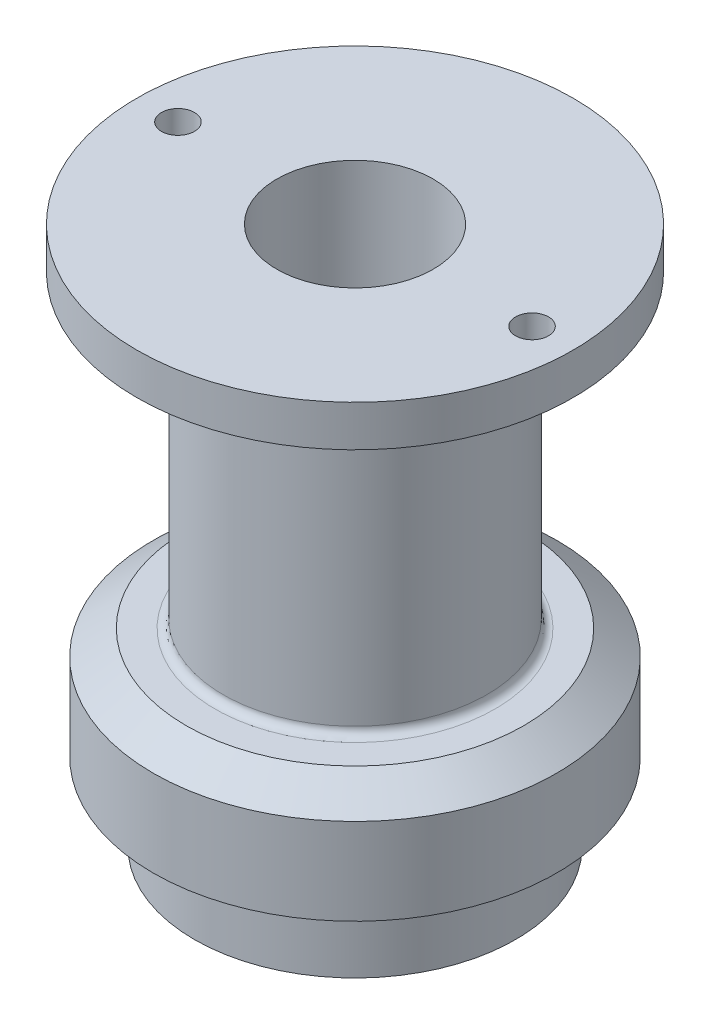
ISO-10303-21;
HEADER;
FILE_DESCRIPTION(('STEP AP214'),'2;1');
FILE_NAME('part.step','',(''),(''),'','','');
FILE_SCHEMA(('AUTOMOTIVE_DESIGN { 1 0 10303 214 1 1 1 1 }'));
ENDSEC;
DATA;
#1=APPLICATION_CONTEXT('core data for automotive mechanical design processes');
#2=APPLICATION_PROTOCOL_DEFINITION('international standard','automotive_design',2000,#1);
#3=PRODUCT_CONTEXT('',#1,'mechanical');
#4=PRODUCT('Part','Part','',(#3));
#5=PRODUCT_RELATED_PRODUCT_CATEGORY('part','',(#4));
#6=PRODUCT_DEFINITION_FORMATION('','',#4);
#7=PRODUCT_DEFINITION_CONTEXT('part definition',#1,'design');
#8=PRODUCT_DEFINITION('design','',#6,#7);
#9=PRODUCT_DEFINITION_SHAPE('','',#8);
#10=(LENGTH_UNIT() NAMED_UNIT(*) SI_UNIT(.MILLI.,.METRE.));
#11=(NAMED_UNIT(*) PLANE_ANGLE_UNIT() SI_UNIT($,.RADIAN.));
#12=(NAMED_UNIT(*) SI_UNIT($,.STERADIAN.) SOLID_ANGLE_UNIT());
#13=UNCERTAINTY_MEASURE_WITH_UNIT(LENGTH_MEASURE(1.E-05),#10,'distance_accuracy_value','');
#14=(GEOMETRIC_REPRESENTATION_CONTEXT(3) GLOBAL_UNCERTAINTY_ASSIGNED_CONTEXT((#13)) GLOBAL_UNIT_ASSIGNED_CONTEXT((#10,
#11,#12)) REPRESENTATION_CONTEXT('',''));
#15=CARTESIAN_POINT('',(0.,0.,0.));
#16=DIRECTION('',(0.,0.,1.));
#17=DIRECTION('',(1.,0.,0.));
#18=AXIS2_PLACEMENT_3D('',#15,#16,#17);
#19=CARTESIAN_POINT('',(0.,0.,0.));
#20=DIRECTION('',(0.,-1.,0.));
#21=DIRECTION('',(0.,0.,-1.));
#22=AXIS2_PLACEMENT_3D('',#19,#20,#21);
#23=CYLINDRICAL_SURFACE('',#22,13.5);
#24=CARTESIAN_POINT('',(0.,0.,0.));
#25=DIRECTION('',(0.,-1.,0.));
#26=DIRECTION('',(0.,0.,-1.));
#27=AXIS2_PLACEMENT_3D('',#24,#25,#26);
#28=CIRCLE('',#27,13.5);
#29=CARTESIAN_POINT('',(0.,0.,-13.5));
#30=VERTEX_POINT('',#29);
#31=EDGE_CURVE('E47',#30,#30,#28,.T.);
#32=ORIENTED_EDGE('',*,*,#31,.T.);
#33=EDGE_LOOP('',(#32));
#34=FACE_BOUND('',#33,.T.);
#35=CARTESIAN_POINT('',(0.,8.,0.));
#36=DIRECTION('',(0.,-1.,0.));
#37=DIRECTION('',(0.,0.,-1.));
#38=AXIS2_PLACEMENT_3D('',#35,#36,#37);
#39=CIRCLE('',#38,13.5);
#40=CARTESIAN_POINT('',(0.,8.,-13.5));
#41=VERTEX_POINT('',#40);
#42=EDGE_CURVE('E10',#41,#41,#39,.T.);
#43=ORIENTED_EDGE('',*,*,#42,.F.);
#44=EDGE_LOOP('',(#43));
#45=FACE_BOUND('',#44,.T.);
#46=ADVANCED_FACE('F30',(#34,#45),#23,.F.);
#47=CARTESIAN_POINT('',(6.5,8.,0.));
#48=DIRECTION('',(0.,-1.,0.));
#49=DIRECTION('',(0.,0.,-1.));
#50=AXIS2_PLACEMENT_3D('',#47,#48,#49);
#51=PLANE('',#50);
#52=ORIENTED_EDGE('',*,*,#42,.T.);
#53=EDGE_LOOP('',(#52));
#54=FACE_BOUND('',#53,.T.);
#55=CARTESIAN_POINT('',(0.,8.,0.));
#56=DIRECTION('',(0.,-1.,0.));
#57=DIRECTION('',(0.,0.,-1.));
#58=AXIS2_PLACEMENT_3D('',#55,#56,#57);
#59=CIRCLE('',#58,6.5);
#60=CARTESIAN_POINT('',(0.,8.,-6.5));
#61=VERTEX_POINT('',#60);
#62=EDGE_CURVE('E37',#61,#61,#59,.T.);
#63=ORIENTED_EDGE('',*,*,#62,.F.);
#64=EDGE_LOOP('',(#63));
#65=FACE_BOUND('',#64,.T.);
#66=ADVANCED_FACE('F125',(#54,#65),#51,.T.);
#67=CARTESIAN_POINT('',(0.,0.,0.));
#68=DIRECTION('',(0.,-1.,0.));
#69=DIRECTION('',(0.,0.,-1.));
#70=AXIS2_PLACEMENT_3D('',#67,#68,#69);
#71=CYLINDRICAL_SURFACE('',#70,6.5);
#72=ORIENTED_EDGE('',*,*,#62,.T.);
#73=EDGE_LOOP('',(#72));
#74=FACE_BOUND('',#73,.T.);
#75=CARTESIAN_POINT('',(0.,16.5,0.));
#76=DIRECTION('',(0.,-1.,0.));
#77=DIRECTION('',(0.,0.,-1.));
#78=AXIS2_PLACEMENT_3D('',#75,#76,#77);
#79=CIRCLE('',#78,6.5);
#80=CARTESIAN_POINT('',(0.,16.5,-6.5));
#81=VERTEX_POINT('',#80);
#82=EDGE_CURVE('E42',#81,#81,#79,.T.);
#83=ORIENTED_EDGE('',*,*,#82,.F.);
#84=EDGE_LOOP('',(#83));
#85=FACE_BOUND('',#84,.T.);
#86=ADVANCED_FACE('F123',(#74,#85),#71,.F.);
#87=CARTESIAN_POINT('',(0.,17.,0.));
#88=DIRECTION('',(0.,1.,0.));
#89=DIRECTION('',(0.,0.,1.));
#90=AXIS2_PLACEMENT_3D('',#87,#88,#89);
#91=CONICAL_SURFACE('',#90,7.,0.785398163397448);
#92=ORIENTED_EDGE('',*,*,#82,.T.);
#93=EDGE_LOOP('',(#92));
#94=FACE_BOUND('',#93,.T.);
#95=CARTESIAN_POINT('',(0.,17.,0.));
#96=DIRECTION('',(0.,-1.,0.));
#97=DIRECTION('',(0.,0.,-1.));
#98=AXIS2_PLACEMENT_3D('',#95,#96,#97);
#99=CIRCLE('',#98,7.);
#100=CARTESIAN_POINT('',(0.,17.,-7.));
#101=VERTEX_POINT('',#100);
#102=EDGE_CURVE('E115',#101,#101,#99,.T.);
#103=ORIENTED_EDGE('',*,*,#102,.F.);
#104=EDGE_LOOP('',(#103));
#105=FACE_BOUND('',#104,.T.);
#106=ADVANCED_FACE('F120',(#94,#105),#91,.F.);
#107=CARTESIAN_POINT('',(0.,0.,0.));
#108=DIRECTION('',(0.,-1.,0.));
#109=DIRECTION('',(0.,0.,-1.));
#110=AXIS2_PLACEMENT_3D('',#107,#108,#109);
#111=CYLINDRICAL_SURFACE('',#110,7.);
#112=ORIENTED_EDGE('',*,*,#102,.T.);
#113=EDGE_LOOP('',(#112));
#114=FACE_BOUND('',#113,.T.);
#115=CARTESIAN_POINT('',(0.,37.,0.));
#116=DIRECTION('',(0.,-1.,0.));
#117=DIRECTION('',(0.,0.,-1.));
#118=AXIS2_PLACEMENT_3D('',#115,#116,#117);
#119=CIRCLE('',#118,6.99999999999999);
#120=CARTESIAN_POINT('',(0.,37.,-6.99999999999999));
#121=VERTEX_POINT('',#120);
#122=EDGE_CURVE('E112',#121,#121,#119,.T.);
#123=ORIENTED_EDGE('',*,*,#122,.F.);
#124=EDGE_LOOP('',(#123));
#125=FACE_BOUND('',#124,.T.);
#126=ADVANCED_FACE('F132',(#114,#125),#111,.F.);
#127=CARTESIAN_POINT('',(0.,37.5,0.));
#128=DIRECTION('',(0.,-1.,0.));
#129=DIRECTION('',(0.,0.,-1.));
#130=AXIS2_PLACEMENT_3D('',#127,#128,#129);
#131=CONICAL_SURFACE('',#130,6.49999999999999,0.785398163397449);
#132=ORIENTED_EDGE('',*,*,#122,.T.);
#133=EDGE_LOOP('',(#132));
#134=FACE_BOUND('',#133,.T.);
#135=CARTESIAN_POINT('',(0.,37.5,0.));
#136=DIRECTION('',(0.,-1.,0.));
#137=DIRECTION('',(0.,0.,-1.));
#138=AXIS2_PLACEMENT_3D('',#135,#136,#137);
#139=CIRCLE('',#138,6.49999999999999);
#140=CARTESIAN_POINT('',(0.,37.5,-6.49999999999999));
#141=VERTEX_POINT('',#140);
#142=EDGE_CURVE('E109',#141,#141,#139,.T.);
#143=ORIENTED_EDGE('',*,*,#142,.F.);
#144=EDGE_LOOP('',(#143));
#145=FACE_BOUND('',#144,.T.);
#146=ADVANCED_FACE('F216',(#134,#145),#131,.F.);
#147=CARTESIAN_POINT('',(0.,0.,0.));
#148=DIRECTION('',(0.,-1.,0.));
#149=DIRECTION('',(0.,0.,-1.));
#150=AXIS2_PLACEMENT_3D('',#147,#148,#149);
#151=CYLINDRICAL_SURFACE('',#150,6.49999999999999);
#152=ORIENTED_EDGE('',*,*,#142,.T.);
#153=EDGE_LOOP('',(#152));
#154=FACE_BOUND('',#153,.T.);
#155=CARTESIAN_POINT('',(0.,44.5,0.));
#156=DIRECTION('',(0.,-1.,0.));
#157=DIRECTION('',(0.,0.,-1.));
#158=AXIS2_PLACEMENT_3D('',#155,#156,#157);
#159=CIRCLE('',#158,6.49999999999999);
#160=CARTESIAN_POINT('',(0.,44.5,-6.49999999999999));
#161=VERTEX_POINT('',#160);
#162=EDGE_CURVE('E106',#161,#161,#159,.T.);
#163=ORIENTED_EDGE('',*,*,#162,.F.);
#164=EDGE_LOOP('',(#163));
#165=FACE_BOUND('',#164,.T.);
#166=ADVANCED_FACE('F212',(#154,#165),#151,.F.);
#167=CARTESIAN_POINT('',(0.,48.,0.));
#168=DIRECTION('',(0.,1.,0.));
#169=DIRECTION('',(0.,0.,1.));
#170=AXIS2_PLACEMENT_3D('',#167,#168,#169);
#171=CONICAL_SURFACE('',#170,9.5,0.708626272127671);
#172=ORIENTED_EDGE('',*,*,#162,.T.);
#173=EDGE_LOOP('',(#172));
#174=FACE_BOUND('',#173,.T.);
#175=CARTESIAN_POINT('',(0.,48.,0.));
#176=DIRECTION('',(0.,-1.,0.));
#177=DIRECTION('',(0.,0.,-1.));
#178=AXIS2_PLACEMENT_3D('',#175,#176,#177);
#179=CIRCLE('',#178,9.5);
#180=CARTESIAN_POINT('',(0.,48.,-9.5));
#181=VERTEX_POINT('',#180);
#182=EDGE_CURVE('E103',#181,#181,#179,.T.);
#183=ORIENTED_EDGE('',*,*,#182,.F.);
#184=EDGE_LOOP('',(#183));
#185=FACE_BOUND('',#184,.T.);
#186=ADVANCED_FACE('F208',(#174,#185),#171,.F.);
#187=CARTESIAN_POINT('',(0.,0.,0.));
#188=DIRECTION('',(0.,-1.,0.));
#189=DIRECTION('',(0.,0.,-1.));
#190=AXIS2_PLACEMENT_3D('',#187,#188,#189);
#191=CYLINDRICAL_SURFACE('',#190,9.5);
#192=ORIENTED_EDGE('',*,*,#182,.T.);
#193=EDGE_LOOP('',(#192));
#194=FACE_BOUND('',#193,.T.);
#195=CARTESIAN_POINT('',(0.,65.5,0.));
#196=DIRECTION('',(0.,-1.,0.));
#197=DIRECTION('',(0.,0.,-1.));
#198=AXIS2_PLACEMENT_3D('',#195,#196,#197);
#199=CIRCLE('',#198,9.49999999999999);
#200=CARTESIAN_POINT('',(0.,65.5,-9.49999999999999));
#201=VERTEX_POINT('',#200);
#202=EDGE_CURVE('E100',#201,#201,#199,.T.);
#203=ORIENTED_EDGE('',*,*,#202,.F.);
#204=EDGE_LOOP('',(#203));
#205=FACE_BOUND('',#204,.T.);
#206=ADVANCED_FACE('F204',(#194,#205),#191,.F.);
#207=CARTESIAN_POINT('',(26.5,65.5,0.));
#208=DIRECTION('',(0.,1.,0.));
#209=DIRECTION('',(0.,0.,1.));
#210=AXIS2_PLACEMENT_3D('',#207,#208,#209);
#211=PLANE('',#210);
#212=CARTESIAN_POINT('',(-21.5,65.5,0.));
#213=DIRECTION('',(0.,1.,0.));
#214=DIRECTION('',(0.,0.,1.));
#215=AXIS2_PLACEMENT_3D('',#212,#213,#214);
#216=CIRCLE('',#215,2.);
#217=CARTESIAN_POINT('',(-21.5,65.5,2.));
#218=VERTEX_POINT('',#217);
#219=EDGE_CURVE('E59',#218,#218,#216,.T.);
#220=ORIENTED_EDGE('',*,*,#219,.F.);
#221=EDGE_LOOP('',(#220));
#222=FACE_BOUND('',#221,.T.);
#223=CARTESIAN_POINT('',(21.5,65.5,0.));
#224=DIRECTION('',(0.,1.,0.));
#225=DIRECTION('',(0.,0.,1.));
#226=AXIS2_PLACEMENT_3D('',#223,#224,#225);
#227=CIRCLE('',#226,2.);
#228=CARTESIAN_POINT('',(21.5,65.5,2.));
#229=VERTEX_POINT('',#228);
#230=EDGE_CURVE('E48',#229,#229,#227,.T.);
#231=ORIENTED_EDGE('',*,*,#230,.F.);
#232=EDGE_LOOP('',(#231));
#233=FACE_BOUND('',#232,.T.);
#234=ORIENTED_EDGE('',*,*,#202,.T.);
#235=EDGE_LOOP('',(#234));
#236=FACE_BOUND('',#235,.T.);
#237=CARTESIAN_POINT('',(0.,65.5,0.));
#238=DIRECTION('',(0.,-1.,0.));
#239=DIRECTION('',(0.,0.,-1.));
#240=AXIS2_PLACEMENT_3D('',#237,#238,#239);
#241=CIRCLE('',#240,26.5);
#242=CARTESIAN_POINT('',(0.,65.5,-26.5));
#243=VERTEX_POINT('',#242);
#244=EDGE_CURVE('E97',#243,#243,#241,.T.);
#245=ORIENTED_EDGE('',*,*,#244,.F.);
#246=EDGE_LOOP('',(#245));
#247=FACE_BOUND('',#246,.T.);
#248=ADVANCED_FACE('F200',(#222,#233,#236,#247),#211,.T.);
#249=CARTESIAN_POINT('',(0.,0.,0.));
#250=DIRECTION('',(0.,-1.,0.));
#251=DIRECTION('',(0.,0.,-1.));
#252=AXIS2_PLACEMENT_3D('',#249,#250,#251);
#253=CYLINDRICAL_SURFACE('',#252,26.5);
#254=ORIENTED_EDGE('',*,*,#244,.T.);
#255=EDGE_LOOP('',(#254));
#256=FACE_BOUND('',#255,.T.);
#257=CARTESIAN_POINT('',(0.,60.5,0.));
#258=DIRECTION('',(0.,-1.,0.));
#259=DIRECTION('',(0.,0.,-1.));
#260=AXIS2_PLACEMENT_3D('',#257,#258,#259);
#261=CIRCLE('',#260,26.5);
#262=CARTESIAN_POINT('',(0.,60.5,-26.5));
#263=VERTEX_POINT('',#262);
#264=EDGE_CURVE('E94',#263,#263,#261,.T.);
#265=ORIENTED_EDGE('',*,*,#264,.F.);
#266=EDGE_LOOP('',(#265));
#267=FACE_BOUND('',#266,.T.);
#268=ADVANCED_FACE('F196',(#256,#267),#253,.T.);
#269=CARTESIAN_POINT('',(17.,60.5,0.));
#270=DIRECTION('',(0.,-1.,0.));
#271=DIRECTION('',(0.,0.,-1.));
#272=AXIS2_PLACEMENT_3D('',#269,#270,#271);
#273=PLANE('',#272);
#274=CARTESIAN_POINT('',(-21.5,60.5,0.));
#275=DIRECTION('',(0.,-1.,0.));
#276=DIRECTION('',(0.,0.,-1.));
#277=AXIS2_PLACEMENT_3D('',#274,#275,#276);
#278=CIRCLE('',#277,2.);
#279=CARTESIAN_POINT('',(-21.5,60.5,-2.));
#280=VERTEX_POINT('',#279);
#281=EDGE_CURVE('E33',#280,#280,#278,.T.);
#282=ORIENTED_EDGE('',*,*,#281,.F.);
#283=EDGE_LOOP('',(#282));
#284=FACE_BOUND('',#283,.T.);
#285=CARTESIAN_POINT('',(21.5,60.5,0.));
#286=DIRECTION('',(0.,-1.,0.));
#287=DIRECTION('',(0.,0.,-1.));
#288=AXIS2_PLACEMENT_3D('',#285,#286,#287);
#289=CIRCLE('',#288,2.);
#290=CARTESIAN_POINT('',(21.5,60.5,-2.));
#291=VERTEX_POINT('',#290);
#292=EDGE_CURVE('E45',#291,#291,#289,.T.);
#293=ORIENTED_EDGE('',*,*,#292,.F.);
#294=EDGE_LOOP('',(#293));
#295=FACE_BOUND('',#294,.T.);
#296=ORIENTED_EDGE('',*,*,#264,.T.);
#297=EDGE_LOOP('',(#296));
#298=FACE_BOUND('',#297,.T.);
#299=CARTESIAN_POINT('',(0.,60.5,0.));
#300=DIRECTION('',(0.,-1.,0.));
#301=DIRECTION('',(0.,0.,-1.));
#302=AXIS2_PLACEMENT_3D('',#299,#300,#301);
#303=CIRCLE('',#302,17.);
#304=CARTESIAN_POINT('',(0.,60.5,-17.));
#305=VERTEX_POINT('',#304);
#306=EDGE_CURVE('E91',#305,#305,#303,.T.);
#307=ORIENTED_EDGE('',*,*,#306,.F.);
#308=EDGE_LOOP('',(#307));
#309=FACE_BOUND('',#308,.T.);
#310=ADVANCED_FACE('F192',(#284,#295,#298,#309),#273,.T.);
#311=CARTESIAN_POINT('',(0.,59.5,0.));
#312=DIRECTION('',(0.,-1.,0.));
#313=DIRECTION('',(0.,0.,-1.));
#314=AXIS2_PLACEMENT_3D('',#311,#312,#313);
#315=TOROIDAL_SURFACE('',#314,17.,1.);
#316=ORIENTED_EDGE('',*,*,#306,.T.);
#317=EDGE_LOOP('',(#316));
#318=FACE_BOUND('',#317,.T.);
#319=CARTESIAN_POINT('',(0.,59.5,0.));
#320=DIRECTION('',(0.,-1.,0.));
#321=DIRECTION('',(0.,0.,-1.));
#322=AXIS2_PLACEMENT_3D('',#319,#320,#321);
#323=CIRCLE('',#322,16.);
#324=CARTESIAN_POINT('',(0.,59.5,-16.));
#325=VERTEX_POINT('',#324);
#326=EDGE_CURVE('E88',#325,#325,#323,.T.);
#327=ORIENTED_EDGE('',*,*,#326,.F.);
#328=EDGE_LOOP('',(#327));
#329=FACE_BOUND('',#328,.T.);
#330=ADVANCED_FACE('F188',(#318,#329),#315,.F.);
#331=CARTESIAN_POINT('',(0.,0.,0.));
#332=DIRECTION('',(0.,-1.,0.));
#333=DIRECTION('',(0.,0.,-1.));
#334=AXIS2_PLACEMENT_3D('',#331,#332,#333);
#335=CYLINDRICAL_SURFACE('',#334,16.);
#336=ORIENTED_EDGE('',*,*,#326,.T.);
#337=EDGE_LOOP('',(#336));
#338=FACE_BOUND('',#337,.T.);
#339=CARTESIAN_POINT('',(0.,24.,0.));
#340=DIRECTION('',(0.,-1.,0.));
#341=DIRECTION('',(0.,0.,-1.));
#342=AXIS2_PLACEMENT_3D('',#339,#340,#341);
#343=CIRCLE('',#342,16.);
#344=CARTESIAN_POINT('',(0.,24.,-16.));
#345=VERTEX_POINT('',#344);
#346=EDGE_CURVE('E85',#345,#345,#343,.T.);
#347=ORIENTED_EDGE('',*,*,#346,.F.);
#348=EDGE_LOOP('',(#347));
#349=FACE_BOUND('',#348,.T.);
#350=ADVANCED_FACE('F184',(#338,#349),#335,.T.);
#351=CARTESIAN_POINT('',(0.,24.,0.));
#352=DIRECTION('',(0.,-1.,0.));
#353=DIRECTION('',(0.,0.,-1.));
#354=AXIS2_PLACEMENT_3D('',#351,#352,#353);
#355=TOROIDAL_SURFACE('',#354,17.,0.999999999999999);
#356=ORIENTED_EDGE('',*,*,#346,.T.);
#357=EDGE_LOOP('',(#356));
#358=FACE_BOUND('',#357,.T.);
#359=CARTESIAN_POINT('',(0.,23.,0.));
#360=DIRECTION('',(0.,-1.,0.));
#361=DIRECTION('',(0.,0.,-1.));
#362=AXIS2_PLACEMENT_3D('',#359,#360,#361);
#363=CIRCLE('',#362,17.);
#364=CARTESIAN_POINT('',(0.,23.,-17.));
#365=VERTEX_POINT('',#364);
#366=EDGE_CURVE('E82',#365,#365,#363,.T.);
#367=ORIENTED_EDGE('',*,*,#366,.F.);
#368=EDGE_LOOP('',(#367));
#369=FACE_BOUND('',#368,.T.);
#370=ADVANCED_FACE('F180',(#358,#369),#355,.F.);
#371=CARTESIAN_POINT('',(20.5,23.,0.));
#372=DIRECTION('',(0.,1.,0.));
#373=DIRECTION('',(0.,0.,1.));
#374=AXIS2_PLACEMENT_3D('',#371,#372,#373);
#375=PLANE('',#374);
#376=ORIENTED_EDGE('',*,*,#366,.T.);
#377=EDGE_LOOP('',(#376));
#378=FACE_BOUND('',#377,.T.);
#379=CARTESIAN_POINT('',(0.,23.,0.));
#380=DIRECTION('',(0.,-1.,0.));
#381=DIRECTION('',(0.,0.,-1.));
#382=AXIS2_PLACEMENT_3D('',#379,#380,#381);
#383=CIRCLE('',#382,20.5);
#384=CARTESIAN_POINT('',(0.,23.,-20.5));
#385=VERTEX_POINT('',#384);
#386=EDGE_CURVE('E79',#385,#385,#383,.T.);
#387=ORIENTED_EDGE('',*,*,#386,.F.);
#388=EDGE_LOOP('',(#387));
#389=FACE_BOUND('',#388,.T.);
#390=ADVANCED_FACE('F176',(#378,#389),#375,.T.);
#391=CARTESIAN_POINT('',(0.,20.,0.));
#392=DIRECTION('',(0.,-1.,0.));
#393=DIRECTION('',(0.,0.,-1.));
#394=AXIS2_PLACEMENT_3D('',#391,#392,#393);
#395=CONICAL_SURFACE('',#394,24.5,0.927295218001613);
#396=ORIENTED_EDGE('',*,*,#386,.T.);
#397=EDGE_LOOP('',(#396));
#398=FACE_BOUND('',#397,.T.);
#399=CARTESIAN_POINT('',(0.,20.,0.));
#400=DIRECTION('',(0.,-1.,0.));
#401=DIRECTION('',(0.,0.,-1.));
#402=AXIS2_PLACEMENT_3D('',#399,#400,#401);
#403=CIRCLE('',#402,24.5);
#404=CARTESIAN_POINT('',(0.,20.,-24.5));
#405=VERTEX_POINT('',#404);
#406=EDGE_CURVE('E76',#405,#405,#403,.T.);
#407=ORIENTED_EDGE('',*,*,#406,.F.);
#408=EDGE_LOOP('',(#407));
#409=FACE_BOUND('',#408,.T.);
#410=ADVANCED_FACE('F172',(#398,#409),#395,.T.);
#411=CARTESIAN_POINT('',(0.,0.,0.));
#412=DIRECTION('',(0.,-1.,0.));
#413=DIRECTION('',(0.,0.,-1.));
#414=AXIS2_PLACEMENT_3D('',#411,#412,#413);
#415=CYLINDRICAL_SURFACE('',#414,24.5);
#416=ORIENTED_EDGE('',*,*,#406,.T.);
#417=EDGE_LOOP('',(#416));
#418=FACE_BOUND('',#417,.T.);
#419=CARTESIAN_POINT('',(0.,9.5,0.));
#420=DIRECTION('',(0.,-1.,0.));
#421=DIRECTION('',(0.,0.,-1.));
#422=AXIS2_PLACEMENT_3D('',#419,#420,#421);
#423=CIRCLE('',#422,24.5);
#424=CARTESIAN_POINT('',(0.,9.5,-24.5));
#425=VERTEX_POINT('',#424);
#426=EDGE_CURVE('E73',#425,#425,#423,.T.);
#427=ORIENTED_EDGE('',*,*,#426,.F.);
#428=EDGE_LOOP('',(#427));
#429=FACE_BOUND('',#428,.T.);
#430=ADVANCED_FACE('F168',(#418,#429),#415,.T.);
#431=CARTESIAN_POINT('',(18.,9.5,0.));
#432=DIRECTION('',(0.,-1.,0.));
#433=DIRECTION('',(0.,0.,-1.));
#434=AXIS2_PLACEMENT_3D('',#431,#432,#433);
#435=PLANE('',#434);
#436=ORIENTED_EDGE('',*,*,#426,.T.);
#437=EDGE_LOOP('',(#436));
#438=FACE_BOUND('',#437,.T.);
#439=CARTESIAN_POINT('',(0.,9.5,0.));
#440=DIRECTION('',(0.,-1.,0.));
#441=DIRECTION('',(0.,0.,-1.));
#442=AXIS2_PLACEMENT_3D('',#439,#440,#441);
#443=CIRCLE('',#442,18.);
#444=CARTESIAN_POINT('',(0.,9.5,-18.));
#445=VERTEX_POINT('',#444);
#446=EDGE_CURVE('E70',#445,#445,#443,.T.);
#447=ORIENTED_EDGE('',*,*,#446,.F.);
#448=EDGE_LOOP('',(#447));
#449=FACE_BOUND('',#448,.T.);
#450=ADVANCED_FACE('F164',(#438,#449),#435,.T.);
#451=CARTESIAN_POINT('',(0.,0.,0.));
#452=DIRECTION('',(0.,-1.,0.));
#453=DIRECTION('',(0.,0.,-1.));
#454=AXIS2_PLACEMENT_3D('',#451,#452,#453);
#455=CYLINDRICAL_SURFACE('',#454,18.);
#456=ORIENTED_EDGE('',*,*,#446,.T.);
#457=EDGE_LOOP('',(#456));
#458=FACE_BOUND('',#457,.T.);
#459=CARTESIAN_POINT('',(0.,8.,0.));
#460=DIRECTION('',(0.,-1.,0.));
#461=DIRECTION('',(0.,0.,-1.));
#462=AXIS2_PLACEMENT_3D('',#459,#460,#461);
#463=CIRCLE('',#462,18.);
#464=CARTESIAN_POINT('',(0.,8.,-18.));
#465=VERTEX_POINT('',#464);
#466=EDGE_CURVE('E67',#465,#465,#463,.T.);
#467=ORIENTED_EDGE('',*,*,#466,.F.);
#468=EDGE_LOOP('',(#467));
#469=FACE_BOUND('',#468,.T.);
#470=ADVANCED_FACE('F160',(#458,#469),#455,.T.);
#471=CARTESIAN_POINT('',(19.5,8.,0.));
#472=DIRECTION('',(0.,1.,0.));
#473=DIRECTION('',(0.,0.,1.));
#474=AXIS2_PLACEMENT_3D('',#471,#472,#473);
#475=PLANE('',#474);
#476=ORIENTED_EDGE('',*,*,#466,.T.);
#477=EDGE_LOOP('',(#476));
#478=FACE_BOUND('',#477,.T.);
#479=CARTESIAN_POINT('',(0.,8.,0.));
#480=DIRECTION('',(0.,-1.,0.));
#481=DIRECTION('',(0.,0.,-1.));
#482=AXIS2_PLACEMENT_3D('',#479,#480,#481);
#483=CIRCLE('',#482,19.5);
#484=CARTESIAN_POINT('',(0.,8.,-19.5));
#485=VERTEX_POINT('',#484);
#486=EDGE_CURVE('E64',#485,#485,#483,.T.);
#487=ORIENTED_EDGE('',*,*,#486,.F.);
#488=EDGE_LOOP('',(#487));
#489=FACE_BOUND('',#488,.T.);
#490=ADVANCED_FACE('F153',(#478,#489),#475,.T.);
#491=CARTESIAN_POINT('',(0.,0.,0.));
#492=DIRECTION('',(0.,-1.,0.));
#493=DIRECTION('',(0.,0.,-1.));
#494=AXIS2_PLACEMENT_3D('',#491,#492,#493);
#495=CYLINDRICAL_SURFACE('',#494,19.5);
#496=ORIENTED_EDGE('',*,*,#486,.T.);
#497=EDGE_LOOP('',(#496));
#498=FACE_BOUND('',#497,.T.);
#499=CARTESIAN_POINT('',(0.,0.,0.));
#500=DIRECTION('',(0.,-1.,0.));
#501=DIRECTION('',(0.,0.,-1.));
#502=AXIS2_PLACEMENT_3D('',#499,#500,#501);
#503=CIRCLE('',#502,19.5);
#504=CARTESIAN_POINT('',(0.,0.,-19.5));
#505=VERTEX_POINT('',#504);
#506=EDGE_CURVE('E52',#505,#505,#503,.T.);
#507=ORIENTED_EDGE('',*,*,#506,.F.);
#508=EDGE_LOOP('',(#507));
#509=FACE_BOUND('',#508,.T.);
#510=ADVANCED_FACE('F144',(#498,#509),#495,.T.);
#511=CARTESIAN_POINT('',(13.5,0.,0.));
#512=DIRECTION('',(0.,-1.,0.));
#513=DIRECTION('',(0.,0.,-1.));
#514=AXIS2_PLACEMENT_3D('',#511,#512,#513);
#515=PLANE('',#514);
#516=ORIENTED_EDGE('',*,*,#506,.T.);
#517=EDGE_LOOP('',(#516));
#518=FACE_BOUND('',#517,.T.);
#519=ORIENTED_EDGE('',*,*,#31,.F.);
#520=EDGE_LOOP('',(#519));
#521=FACE_BOUND('',#520,.T.);
#522=ADVANCED_FACE('F141',(#518,#521),#515,.T.);
#523=CARTESIAN_POINT('',(21.5,55.5,0.));
#524=DIRECTION('',(0.,1.,0.));
#525=DIRECTION('',(0.,0.,1.));
#526=AXIS2_PLACEMENT_3D('',#523,#524,#525);
#527=CYLINDRICAL_SURFACE('',#526,2.);
#528=ORIENTED_EDGE('',*,*,#292,.T.);
#529=EDGE_LOOP('',(#528));
#530=FACE_BOUND('',#529,.T.);
#531=ORIENTED_EDGE('',*,*,#230,.T.);
#532=EDGE_LOOP('',(#531));
#533=FACE_BOUND('',#532,.T.);
#534=ADVANCED_FACE('F143',(#530,#533),#527,.F.);
#535=CARTESIAN_POINT('',(-21.5,55.5,0.));
#536=DIRECTION('',(0.,1.,0.));
#537=DIRECTION('',(0.,0.,1.));
#538=AXIS2_PLACEMENT_3D('',#535,#536,#537);
#539=CYLINDRICAL_SURFACE('',#538,2.);
#540=ORIENTED_EDGE('',*,*,#281,.T.);
#541=EDGE_LOOP('',(#540));
#542=FACE_BOUND('',#541,.T.);
#543=ORIENTED_EDGE('',*,*,#219,.T.);
#544=EDGE_LOOP('',(#543));
#545=FACE_BOUND('',#544,.T.);
#546=ADVANCED_FACE('F151',(#542,#545),#539,.F.);
#547=CLOSED_SHELL('',(#46,#66,#86,#106,#126,#146,#166,#186,#206,#248,#268,#310,#330,#350,#370,
#390,#410,#430,#450,#470,#490,#510,#522,#534,#546));
#548=MANIFOLD_SOLID_BREP('B2',#547);
#549=ADVANCED_BREP_SHAPE_REPRESENTATION('',(#18,#548),#14);
#550=SHAPE_DEFINITION_REPRESENTATION(#9,#549);
ENDSEC;
END-ISO-10303-21;
